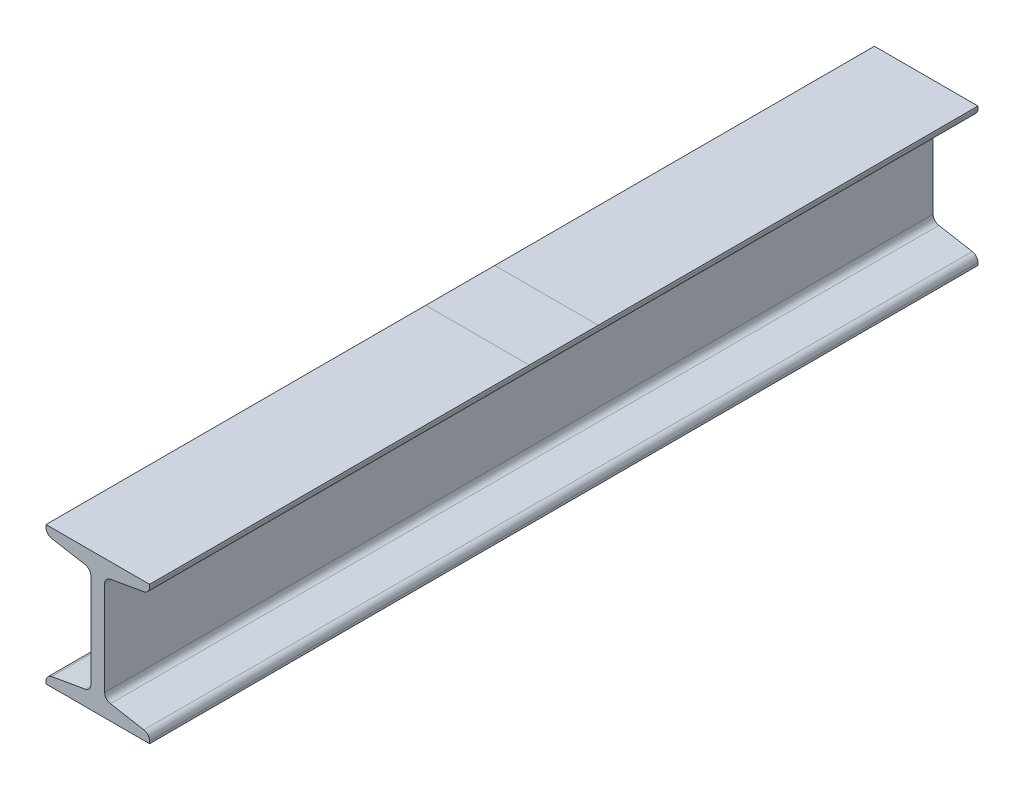
ISO-10303-21;
HEADER;
FILE_DESCRIPTION(('STEP AP214'),'2;1');
FILE_NAME('part.step','',(''),(''),'','','');
FILE_SCHEMA(('AUTOMOTIVE_DESIGN { 1 0 10303 214 1 1 1 1 }'));
ENDSEC;
DATA;
#1=APPLICATION_CONTEXT('core data for automotive mechanical design processes');
#2=APPLICATION_PROTOCOL_DEFINITION('international standard','automotive_design',2000,#1);
#3=PRODUCT_CONTEXT('',#1,'mechanical');
#4=PRODUCT('Part','Part','',(#3));
#5=PRODUCT_RELATED_PRODUCT_CATEGORY('part','',(#4));
#6=PRODUCT_DEFINITION_FORMATION('','',#4);
#7=PRODUCT_DEFINITION_CONTEXT('part definition',#1,'design');
#8=PRODUCT_DEFINITION('design','',#6,#7);
#9=PRODUCT_DEFINITION_SHAPE('','',#8);
#10=(LENGTH_UNIT() NAMED_UNIT(*) SI_UNIT(.MILLI.,.METRE.));
#11=(NAMED_UNIT(*) PLANE_ANGLE_UNIT() SI_UNIT($,.RADIAN.));
#12=(NAMED_UNIT(*) SI_UNIT($,.STERADIAN.) SOLID_ANGLE_UNIT());
#13=UNCERTAINTY_MEASURE_WITH_UNIT(LENGTH_MEASURE(1.E-05),#10,'distance_accuracy_value','');
#14=(GEOMETRIC_REPRESENTATION_CONTEXT(3) GLOBAL_UNCERTAINTY_ASSIGNED_CONTEXT((#13)) GLOBAL_UNIT_ASSIGNED_CONTEXT((#10,
#11,#12)) REPRESENTATION_CONTEXT('',''));
#15=CARTESIAN_POINT('',(0.,0.,0.));
#16=DIRECTION('',(0.,0.,1.));
#17=DIRECTION('',(1.,0.,0.));
#18=AXIS2_PLACEMENT_3D('',#15,#16,#17);
#19=CARTESIAN_POINT('',(-37.5,-50.,-600.));
#20=DIRECTION('',(0.,-1.,0.));
#21=DIRECTION('',(1.,0.,0.));
#22=AXIS2_PLACEMENT_3D('',#19,#20,#21);
#23=PLANE('',#22);
#24=DIRECTION('',(0.,0.,1.));
#25=VECTOR('',#24,1.);
#26=CARTESIAN_POINT('',(-37.5,-50.,-600.));
#27=LINE('',#26,#25);
#28=CARTESIAN_POINT('',(-37.5,-50.,-560.));
#29=VERTEX_POINT('',#28);
#30=CARTESIAN_POINT('',(-37.5,-50.,-40.));
#31=VERTEX_POINT('',#30);
#32=EDGE_CURVE('E471',#29,#31,#27,.T.);
#33=ORIENTED_EDGE('',*,*,#32,.F.);
#34=DIRECTION('',(1.,0.,0.));
#35=VECTOR('',#34,1.);
#36=CARTESIAN_POINT('',(-37.5,-50.,-560.));
#37=LINE('',#36,#35);
#38=CARTESIAN_POINT('',(37.5,-50.,-560.));
#39=VERTEX_POINT('',#38);
#40=EDGE_CURVE('E317',#29,#39,#37,.T.);
#41=ORIENTED_EDGE('',*,*,#40,.T.);
#42=DIRECTION('',(0.,0.,1.));
#43=VECTOR('',#42,1.);
#44=CARTESIAN_POINT('',(37.5,-50.,-600.));
#45=LINE('',#44,#43);
#46=CARTESIAN_POINT('',(37.5,-50.,-39.9999999999999));
#47=VERTEX_POINT('',#46);
#48=EDGE_CURVE('E474',#39,#47,#45,.T.);
#49=ORIENTED_EDGE('',*,*,#48,.T.);
#50=DIRECTION('',(-1.,0.,0.));
#51=VECTOR('',#50,1.);
#52=CARTESIAN_POINT('',(-37.5,-50.,-40.));
#53=LINE('',#52,#51);
#54=EDGE_CURVE('E323',#47,#31,#53,.T.);
#55=ORIENTED_EDGE('',*,*,#54,.T.);
#56=EDGE_LOOP('',(#33,#41,#49,#55));
#57=FACE_BOUND('',#56,.T.);
#58=ADVANCED_FACE('F52',(#57),#23,.T.);
#59=ORIENTED_EDGE('',*,*,#40,.F.);
#60=CARTESIAN_POINT('',(-37.5,-50.,-600.));
#61=VERTEX_POINT('',#60);
#62=EDGE_CURVE('E458',#61,#29,#27,.T.);
#63=ORIENTED_EDGE('',*,*,#62,.F.);
#64=DIRECTION('',(1.,0.,0.));
#65=VECTOR('',#64,1.);
#66=CARTESIAN_POINT('',(-37.5,-50.,-600.));
#67=LINE('',#66,#65);
#68=CARTESIAN_POINT('',(37.5,-50.,-600.));
#69=VERTEX_POINT('',#68);
#70=EDGE_CURVE('E260',#61,#69,#67,.T.);
#71=ORIENTED_EDGE('',*,*,#70,.T.);
#72=EDGE_CURVE('E488',#69,#39,#45,.T.);
#73=ORIENTED_EDGE('',*,*,#72,.T.);
#74=EDGE_LOOP('',(#59,#63,#71,#73));
#75=FACE_BOUND('',#74,.T.);
#76=ADVANCED_FACE('F557',(#75),#23,.T.);
#77=CARTESIAN_POINT('',(-37.5,50.,-600.));
#78=DIRECTION('',(0.,1.,0.));
#79=DIRECTION('',(-1.,0.,0.));
#80=AXIS2_PLACEMENT_3D('',#77,#78,#79);
#81=PLANE('',#80);
#82=DIRECTION('',(0.,0.,1.));
#83=VECTOR('',#82,1.);
#84=CARTESIAN_POINT('',(-37.5,50.,-600.));
#85=LINE('',#84,#83);
#86=CARTESIAN_POINT('',(-37.5,50.,-600.));
#87=VERTEX_POINT('',#86);
#88=CARTESIAN_POINT('',(-37.5,50.,-325.));
#89=VERTEX_POINT('',#88);
#90=EDGE_CURVE('E215',#87,#89,#85,.T.);
#91=ORIENTED_EDGE('',*,*,#90,.T.);
#92=DIRECTION('',(1.,0.,0.));
#93=VECTOR('',#92,1.);
#94=CARTESIAN_POINT('',(-37.5,50.,-325.));
#95=LINE('',#94,#93);
#96=CARTESIAN_POINT('',(37.5,50.,-325.));
#97=VERTEX_POINT('',#96);
#98=EDGE_CURVE('E460',#89,#97,#95,.T.);
#99=ORIENTED_EDGE('',*,*,#98,.T.);
#100=DIRECTION('',(0.,0.,1.));
#101=VECTOR('',#100,1.);
#102=CARTESIAN_POINT('',(37.5,50.,-600.));
#103=LINE('',#102,#101);
#104=CARTESIAN_POINT('',(37.5,50.,-600.));
#105=VERTEX_POINT('',#104);
#106=EDGE_CURVE('E239',#105,#97,#103,.T.);
#107=ORIENTED_EDGE('',*,*,#106,.F.);
#108=DIRECTION('',(-1.,0.,0.));
#109=VECTOR('',#108,1.);
#110=CARTESIAN_POINT('',(-37.5,50.,-600.));
#111=LINE('',#110,#109);
#112=EDGE_CURVE('E232',#105,#87,#111,.T.);
#113=ORIENTED_EDGE('',*,*,#112,.T.);
#114=EDGE_LOOP('',(#91,#99,#107,#113));
#115=FACE_BOUND('',#114,.T.);
#116=ADVANCED_FACE('F237',(#115),#81,.T.);
#117=CARTESIAN_POINT('',(37.5,50.,-275.));
#118=VERTEX_POINT('',#117);
#119=CARTESIAN_POINT('',(37.5,50.,0.));
#120=VERTEX_POINT('',#119);
#121=EDGE_CURVE('E451',#118,#120,#103,.T.);
#122=ORIENTED_EDGE('',*,*,#121,.F.);
#123=DIRECTION('',(-1.,0.,0.));
#124=VECTOR('',#123,1.);
#125=CARTESIAN_POINT('',(-37.5,50.,-275.));
#126=LINE('',#125,#124);
#127=CARTESIAN_POINT('',(-37.5,50.,-275.));
#128=VERTEX_POINT('',#127);
#129=EDGE_CURVE('E453',#118,#128,#126,.T.);
#130=ORIENTED_EDGE('',*,*,#129,.T.);
#131=CARTESIAN_POINT('',(-37.5,50.,0.));
#132=VERTEX_POINT('',#131);
#133=EDGE_CURVE('E228',#128,#132,#85,.T.);
#134=ORIENTED_EDGE('',*,*,#133,.T.);
#135=DIRECTION('',(-1.,0.,0.));
#136=VECTOR('',#135,1.);
#137=CARTESIAN_POINT('',(-37.5,50.,0.));
#138=LINE('',#137,#136);
#139=EDGE_CURVE('E283',#120,#132,#138,.T.);
#140=ORIENTED_EDGE('',*,*,#139,.F.);
#141=EDGE_LOOP('',(#122,#130,#134,#140));
#142=FACE_BOUND('',#141,.T.);
#143=ADVANCED_FACE('F450',(#142),#81,.T.);
#144=ORIENTED_EDGE('',*,*,#98,.F.);
#145=EDGE_CURVE('E222',#89,#128,#85,.T.);
#146=ORIENTED_EDGE('',*,*,#145,.T.);
#147=ORIENTED_EDGE('',*,*,#129,.F.);
#148=EDGE_CURVE('E497',#97,#118,#103,.T.);
#149=ORIENTED_EDGE('',*,*,#148,.F.);
#150=EDGE_LOOP('',(#144,#146,#147,#149));
#151=FACE_BOUND('',#150,.T.);
#152=ADVANCED_FACE('F581',(#151),#81,.T.);
#153=CARTESIAN_POINT('',(37.5,50.,-600.));
#154=DIRECTION('',(1.,0.,0.));
#155=DIRECTION('',(0.,1.,0.));
#156=AXIS2_PLACEMENT_3D('',#153,#154,#155);
#157=PLANE('',#156);
#158=DIRECTION('',(0.,1.,0.));
#159=VECTOR('',#158,1.);
#160=CARTESIAN_POINT('',(37.5,50.,0.));
#161=LINE('',#160,#159);
#162=CARTESIAN_POINT('',(37.5,48.2322176558608,0.));
#163=VERTEX_POINT('',#162);
#164=EDGE_CURVE('E241',#163,#120,#161,.T.);
#165=ORIENTED_EDGE('',*,*,#164,.F.);
#166=DIRECTION('',(0.,0.,1.));
#167=VECTOR('',#166,1.);
#168=CARTESIAN_POINT('',(37.5,48.2322176558608,-600.));
#169=LINE('',#168,#167);
#170=CARTESIAN_POINT('',(37.5,48.2322176558608,-600.));
#171=VERTEX_POINT('',#170);
#172=EDGE_CURVE('E343',#163,#171,#169,.F.);
#173=ORIENTED_EDGE('',*,*,#172,.T.);
#174=DIRECTION('',(0.,1.,0.));
#175=VECTOR('',#174,1.);
#176=CARTESIAN_POINT('',(37.5,50.,-600.));
#177=LINE('',#176,#175);
#178=EDGE_CURVE('E280',#171,#105,#177,.T.);
#179=ORIENTED_EDGE('',*,*,#178,.T.);
#180=ORIENTED_EDGE('',*,*,#106,.T.);
#181=ORIENTED_EDGE('',*,*,#148,.T.);
#182=ORIENTED_EDGE('',*,*,#121,.T.);
#183=EDGE_LOOP('',(#165,#173,#179,#180,#181,#182));
#184=FACE_BOUND('',#183,.T.);
#185=ADVANCED_FACE('F501',(#184),#157,.T.);
#186=CARTESIAN_POINT('',(37.5,44.0367194999744,-600.));
#187=DIRECTION('',(0.173648177666926,-0.984807753012209,0.));
#188=DIRECTION('',(0.984807753012209,0.173648177666926,0.));
#189=AXIS2_PLACEMENT_3D('',#186,#187,#188);
#190=PLANE('',#189);
#191=DIRECTION('',(0.984807753012209,0.173648177666926,0.));
#192=VECTOR('',#191,1.);
#193=CARTESIAN_POINT('',(37.5,44.0367194999744,-600.));
#194=LINE('',#193,#192);
#195=CARTESIAN_POINT('',(9.13175911166539,39.0346332361241,-600.));
#196=VERTEX_POINT('',#195);
#197=CARTESIAN_POINT('',(33.3682408883346,43.3081788907998,-600.));
#198=VERTEX_POINT('',#197);
#199=EDGE_CURVE('E276',#196,#198,#194,.T.);
#200=ORIENTED_EDGE('',*,*,#199,.T.);
#201=DIRECTION('',(0.,0.,1.));
#202=VECTOR('',#201,1.);
#203=CARTESIAN_POINT('',(33.3682408883346,43.3081788907998,-600.));
#204=LINE('',#203,#202);
#205=CARTESIAN_POINT('',(33.3682408883346,43.3081788907998,0.));
#206=VERTEX_POINT('',#205);
#207=EDGE_CURVE('E327',#198,#206,#204,.T.);
#208=ORIENTED_EDGE('',*,*,#207,.T.);
#209=DIRECTION('',(0.984807753012209,0.173648177666926,0.));
#210=VECTOR('',#209,1.);
#211=CARTESIAN_POINT('',(37.5,44.0367194999744,0.));
#212=LINE('',#211,#210);
#213=CARTESIAN_POINT('',(9.13175911166539,39.0346332361241,0.));
#214=VERTEX_POINT('',#213);
#215=EDGE_CURVE('E244',#214,#206,#212,.T.);
#216=ORIENTED_EDGE('',*,*,#215,.F.);
#217=DIRECTION('',(0.,0.,1.));
#218=VECTOR('',#217,1.);
#219=CARTESIAN_POINT('',(9.13175911166539,39.0346332361241,-600.));
#220=LINE('',#219,#218);
#221=EDGE_CURVE('E322',#214,#196,#220,.F.);
#222=ORIENTED_EDGE('',*,*,#221,.T.);
#223=EDGE_LOOP('',(#200,#208,#216,#222));
#224=FACE_BOUND('',#223,.T.);
#225=ADVANCED_FACE('F510',(#224),#190,.T.);
#226=CARTESIAN_POINT('',(5.00000000000002,38.3060926269495,-600.));
#227=DIRECTION('',(1.,0.,0.));
#228=DIRECTION('',(0.,1.,0.));
#229=AXIS2_PLACEMENT_3D('',#226,#227,#228);
#230=PLANE('',#229);
#231=DIRECTION('',(0.,1.,0.));
#232=VECTOR('',#231,1.);
#233=CARTESIAN_POINT('',(5.00000000000002,38.3060926269495,-600.));
#234=LINE('',#233,#232);
#235=CARTESIAN_POINT('',(5.00000000000003,-34.1105944710631,-600.));
#236=VERTEX_POINT('',#235);
#237=CARTESIAN_POINT('',(5.00000000000002,34.1105944710631,-600.));
#238=VERTEX_POINT('',#237);
#239=EDGE_CURVE('E272',#236,#238,#234,.T.);
#240=ORIENTED_EDGE('',*,*,#239,.T.);
#241=DIRECTION('',(0.,0.,1.));
#242=VECTOR('',#241,1.);
#243=CARTESIAN_POINT('',(5.00000000000002,34.1105944710631,-2.22044604925031E-13));
#244=LINE('',#243,#242);
#245=CARTESIAN_POINT('',(5.00000000000002,34.1105944710631,0.));
#246=VERTEX_POINT('',#245);
#247=EDGE_CURVE('E360',#238,#246,#244,.T.);
#248=ORIENTED_EDGE('',*,*,#247,.T.);
#249=DIRECTION('',(0.,1.,0.));
#250=VECTOR('',#249,1.);
#251=CARTESIAN_POINT('',(5.00000000000002,38.3060926269495,0.));
#252=LINE('',#251,#250);
#253=CARTESIAN_POINT('',(5.00000000000003,-34.1105944710631,0.));
#254=VERTEX_POINT('',#253);
#255=EDGE_CURVE('E514',#254,#246,#252,.T.);
#256=ORIENTED_EDGE('',*,*,#255,.F.);
#257=DIRECTION('',(0.,0.,1.));
#258=VECTOR('',#257,1.);
#259=CARTESIAN_POINT('',(5.00000000000003,-34.1105944710631,-600.));
#260=LINE('',#259,#258);
#261=EDGE_CURVE('E357',#254,#236,#260,.F.);
#262=ORIENTED_EDGE('',*,*,#261,.T.);
#263=EDGE_LOOP('',(#240,#248,#256,#262));
#264=FACE_BOUND('',#263,.T.);
#265=ADVANCED_FACE('F543',(#264),#230,.T.);
#266=CARTESIAN_POINT('',(5.00000000000003,-38.3060926269495,-600.));
#267=DIRECTION('',(0.173648177666925,0.984807753012209,0.));
#268=DIRECTION('',(-0.984807753012209,0.173648177666925,0.));
#269=AXIS2_PLACEMENT_3D('',#266,#267,#268);
#270=PLANE('',#269);
#271=DIRECTION('',(-0.984807753012209,0.173648177666925,0.));
#272=VECTOR('',#271,1.);
#273=CARTESIAN_POINT('',(5.00000000000003,-38.3060926269495,0.));
#274=LINE('',#273,#272);
#275=CARTESIAN_POINT('',(33.3682408883346,-43.3081788907998,0.));
#276=VERTEX_POINT('',#275);
#277=CARTESIAN_POINT('',(9.1317591116654,-39.0346332361241,0.));
#278=VERTEX_POINT('',#277);
#279=EDGE_CURVE('E517',#276,#278,#274,.T.);
#280=ORIENTED_EDGE('',*,*,#279,.F.);
#281=DIRECTION('',(0.,0.,1.));
#282=VECTOR('',#281,1.);
#283=CARTESIAN_POINT('',(33.3682408883346,-43.3081788907998,-600.));
#284=LINE('',#283,#282);
#285=CARTESIAN_POINT('',(33.3682408883346,-43.3081788907998,-600.));
#286=VERTEX_POINT('',#285);
#287=EDGE_CURVE('E372',#276,#286,#284,.F.);
#288=ORIENTED_EDGE('',*,*,#287,.T.);
#289=DIRECTION('',(-0.984807753012209,0.173648177666925,0.));
#290=VECTOR('',#289,1.);
#291=CARTESIAN_POINT('',(5.00000000000003,-38.3060926269495,-600.));
#292=LINE('',#291,#290);
#293=CARTESIAN_POINT('',(9.1317591116654,-39.0346332361241,-600.));
#294=VERTEX_POINT('',#293);
#295=EDGE_CURVE('E268',#286,#294,#292,.T.);
#296=ORIENTED_EDGE('',*,*,#295,.T.);
#297=DIRECTION('',(0.,0.,1.));
#298=VECTOR('',#297,1.);
#299=CARTESIAN_POINT('',(9.1317591116654,-39.0346332361241,-2.22044604925031E-13));
#300=LINE('',#299,#298);
#301=EDGE_CURVE('E368',#294,#278,#300,.T.);
#302=ORIENTED_EDGE('',*,*,#301,.T.);
#303=EDGE_LOOP('',(#280,#288,#296,#302));
#304=FACE_BOUND('',#303,.T.);
#305=ADVANCED_FACE('F534',(#304),#270,.T.);
#306=CARTESIAN_POINT('',(37.5,-44.0367194999744,-600.));
#307=DIRECTION('',(1.,0.,0.));
#308=DIRECTION('',(0.,1.,0.));
#309=AXIS2_PLACEMENT_3D('',#306,#307,#308);
#310=PLANE('',#309);
#311=DIRECTION('',(0.,1.,0.));
#312=VECTOR('',#311,1.);
#313=CARTESIAN_POINT('',(37.5,-44.0367194999744,-600.));
#314=LINE('',#313,#312);
#315=CARTESIAN_POINT('',(37.5,-48.2322176558608,-600.));
#316=VERTEX_POINT('',#315);
#317=EDGE_CURVE('E264',#69,#316,#314,.T.);
#318=ORIENTED_EDGE('',*,*,#317,.T.);
#319=DIRECTION('',(0.,0.,1.));
#320=VECTOR('',#319,1.);
#321=CARTESIAN_POINT('',(37.5,-48.2322176558608,-600.));
#322=LINE('',#321,#320);
#323=CARTESIAN_POINT('',(37.5,-48.2322176558608,0.));
#324=VERTEX_POINT('',#323);
#325=EDGE_CURVE('E364',#316,#324,#322,.T.);
#326=ORIENTED_EDGE('',*,*,#325,.T.);
#327=DIRECTION('',(0.,1.,0.));
#328=VECTOR('',#327,1.);
#329=CARTESIAN_POINT('',(37.5,-44.0367194999744,0.));
#330=LINE('',#329,#328);
#331=CARTESIAN_POINT('',(37.5,-50.,0.));
#332=VERTEX_POINT('',#331);
#333=EDGE_CURVE('E311',#332,#324,#330,.T.);
#334=ORIENTED_EDGE('',*,*,#333,.F.);
#335=EDGE_CURVE('E485',#47,#332,#45,.T.);
#336=ORIENTED_EDGE('',*,*,#335,.F.);
#337=ORIENTED_EDGE('',*,*,#48,.F.);
#338=ORIENTED_EDGE('',*,*,#72,.F.);
#339=EDGE_LOOP('',(#318,#326,#334,#336,#337,#338));
#340=FACE_BOUND('',#339,.T.);
#341=ADVANCED_FACE('F525',(#340),#310,.T.);
#342=ORIENTED_EDGE('',*,*,#54,.F.);
#343=ORIENTED_EDGE('',*,*,#335,.T.);
#344=DIRECTION('',(1.,0.,0.));
#345=VECTOR('',#344,1.);
#346=CARTESIAN_POINT('',(-37.5,-50.,0.));
#347=LINE('',#346,#345);
#348=CARTESIAN_POINT('',(-37.5,-50.,0.));
#349=VERTEX_POINT('',#348);
#350=EDGE_CURVE('E306',#349,#332,#347,.T.);
#351=ORIENTED_EDGE('',*,*,#350,.F.);
#352=EDGE_CURVE('E226',#31,#349,#27,.T.);
#353=ORIENTED_EDGE('',*,*,#352,.F.);
#354=EDGE_LOOP('',(#342,#343,#351,#353));
#355=FACE_BOUND('',#354,.T.);
#356=ADVANCED_FACE('F479',(#355),#23,.T.);
#357=CARTESIAN_POINT('',(-37.5,-44.0367194999744,-600.));
#358=DIRECTION('',(-1.,0.,0.));
#359=DIRECTION('',(0.,0.,1.));
#360=AXIS2_PLACEMENT_3D('',#357,#358,#359);
#361=PLANE('',#360);
#362=DIRECTION('',(0.,-1.,0.));
#363=VECTOR('',#362,1.);
#364=CARTESIAN_POINT('',(-37.5,-44.0367194999744,0.));
#365=LINE('',#364,#363);
#366=CARTESIAN_POINT('',(-37.5,-48.2322176558608,0.));
#367=VERTEX_POINT('',#366);
#368=EDGE_CURVE('E303',#367,#349,#365,.T.);
#369=ORIENTED_EDGE('',*,*,#368,.F.);
#370=DIRECTION('',(0.,0.,1.));
#371=VECTOR('',#370,1.);
#372=CARTESIAN_POINT('',(-37.5,-48.2322176558608,-600.));
#373=LINE('',#372,#371);
#374=CARTESIAN_POINT('',(-37.5,-48.2322176558608,-600.));
#375=VERTEX_POINT('',#374);
#376=EDGE_CURVE('E399',#367,#375,#373,.F.);
#377=ORIENTED_EDGE('',*,*,#376,.T.);
#378=DIRECTION('',(0.,-1.,0.));
#379=VECTOR('',#378,1.);
#380=CARTESIAN_POINT('',(-37.5,-44.0367194999744,-600.));
#381=LINE('',#380,#379);
#382=EDGE_CURVE('E257',#375,#61,#381,.T.);
#383=ORIENTED_EDGE('',*,*,#382,.T.);
#384=ORIENTED_EDGE('',*,*,#62,.T.);
#385=ORIENTED_EDGE('',*,*,#32,.T.);
#386=ORIENTED_EDGE('',*,*,#352,.T.);
#387=EDGE_LOOP('',(#369,#377,#383,#384,#385,#386));
#388=FACE_BOUND('',#387,.T.);
#389=ADVANCED_FACE('F565',(#388),#361,.T.);
#390=CARTESIAN_POINT('',(-5.00000000000001,-38.3060926269495,-600.));
#391=DIRECTION('',(-0.173648177666926,0.984807753012209,0.));
#392=DIRECTION('',(-0.984807753012209,-0.173648177666926,0.));
#393=AXIS2_PLACEMENT_3D('',#390,#391,#392);
#394=PLANE('',#393);
#395=DIRECTION('',(-0.984807753012209,-0.173648177666926,0.));
#396=VECTOR('',#395,1.);
#397=CARTESIAN_POINT('',(-5.00000000000001,-38.3060926269495,-600.));
#398=LINE('',#397,#396);
#399=CARTESIAN_POINT('',(-9.13175911166538,-39.0346332361241,-600.));
#400=VERTEX_POINT('',#399);
#401=CARTESIAN_POINT('',(-33.3682408883346,-43.3081788907998,-600.));
#402=VERTEX_POINT('',#401);
#403=EDGE_CURVE('E253',#400,#402,#398,.T.);
#404=ORIENTED_EDGE('',*,*,#403,.T.);
#405=DIRECTION('',(0.,0.,1.));
#406=VECTOR('',#405,1.);
#407=CARTESIAN_POINT('',(-33.3682408883346,-43.3081788907998,-600.));
#408=LINE('',#407,#406);
#409=CARTESIAN_POINT('',(-33.3682408883346,-43.3081788907998,0.));
#410=VERTEX_POINT('',#409);
#411=EDGE_CURVE('E394',#402,#410,#408,.T.);
#412=ORIENTED_EDGE('',*,*,#411,.T.);
#413=DIRECTION('',(-0.984807753012209,-0.173648177666926,0.));
#414=VECTOR('',#413,1.);
#415=CARTESIAN_POINT('',(-5.00000000000001,-38.3060926269495,0.));
#416=LINE('',#415,#414);
#417=CARTESIAN_POINT('',(-9.13175911166538,-39.0346332361241,0.));
#418=VERTEX_POINT('',#417);
#419=EDGE_CURVE('E299',#418,#410,#416,.T.);
#420=ORIENTED_EDGE('',*,*,#419,.F.);
#421=DIRECTION('',(0.,0.,1.));
#422=VECTOR('',#421,1.);
#423=CARTESIAN_POINT('',(-9.13175911166538,-39.0346332361241,-600.));
#424=LINE('',#423,#422);
#425=EDGE_CURVE('E392',#418,#400,#424,.F.);
#426=ORIENTED_EDGE('',*,*,#425,.T.);
#427=EDGE_LOOP('',(#404,#412,#420,#426));
#428=FACE_BOUND('',#427,.T.);
#429=ADVANCED_FACE('F428',(#428),#394,.T.);
#430=CARTESIAN_POINT('',(-5.00000000000002,38.3060926269495,-600.));
#431=DIRECTION('',(-1.,0.,0.));
#432=DIRECTION('',(0.,-1.,0.));
#433=AXIS2_PLACEMENT_3D('',#430,#431,#432);
#434=PLANE('',#433);
#435=DIRECTION('',(0.,-1.,0.));
#436=VECTOR('',#435,1.);
#437=CARTESIAN_POINT('',(-5.00000000000002,38.3060926269495,0.));
#438=LINE('',#437,#436);
#439=CARTESIAN_POINT('',(-5.00000000000002,34.1105944710631,0.));
#440=VERTEX_POINT('',#439);
#441=CARTESIAN_POINT('',(-5.00000000000001,-34.1105944710631,0.));
#442=VERTEX_POINT('',#441);
#443=EDGE_CURVE('E295',#440,#442,#438,.T.);
#444=ORIENTED_EDGE('',*,*,#443,.F.);
#445=DIRECTION('',(0.,0.,1.));
#446=VECTOR('',#445,1.);
#447=CARTESIAN_POINT('',(-5.00000000000002,34.1105944710631,-600.));
#448=LINE('',#447,#446);
#449=CARTESIAN_POINT('',(-5.00000000000002,34.1105944710631,-600.));
#450=VERTEX_POINT('',#449);
#451=EDGE_CURVE('E389',#440,#450,#448,.F.);
#452=ORIENTED_EDGE('',*,*,#451,.T.);
#453=DIRECTION('',(0.,-1.,0.));
#454=VECTOR('',#453,1.);
#455=CARTESIAN_POINT('',(-5.00000000000002,38.3060926269495,-600.));
#456=LINE('',#455,#454);
#457=CARTESIAN_POINT('',(-5.00000000000001,-34.1105944710631,-600.));
#458=VERTEX_POINT('',#457);
#459=EDGE_CURVE('E249',#450,#458,#456,.T.);
#460=ORIENTED_EDGE('',*,*,#459,.T.);
#461=DIRECTION('',(0.,0.,1.));
#462=VECTOR('',#461,1.);
#463=CARTESIAN_POINT('',(-5.00000000000001,-34.1105944710631,0.));
#464=LINE('',#463,#462);
#465=EDGE_CURVE('E385',#458,#442,#464,.T.);
#466=ORIENTED_EDGE('',*,*,#465,.T.);
#467=EDGE_LOOP('',(#444,#452,#460,#466));
#468=FACE_BOUND('',#467,.T.);
#469=ADVANCED_FACE('F433',(#468),#434,.T.);
#470=CARTESIAN_POINT('',(-37.5,44.0367194999744,-600.));
#471=DIRECTION('',(-0.173648177666926,-0.984807753012209,0.));
#472=DIRECTION('',(0.984807753012209,-0.173648177666926,0.));
#473=AXIS2_PLACEMENT_3D('',#470,#471,#472);
#474=PLANE('',#473);
#475=DIRECTION('',(0.984807753012209,-0.173648177666926,0.));
#476=VECTOR('',#475,1.);
#477=CARTESIAN_POINT('',(-37.5,44.0367194999744,0.));
#478=LINE('',#477,#476);
#479=CARTESIAN_POINT('',(-33.3682408883346,43.3081788907998,0.));
#480=VERTEX_POINT('',#479);
#481=CARTESIAN_POINT('',(-9.13175911166539,39.0346332361241,0.));
#482=VERTEX_POINT('',#481);
#483=EDGE_CURVE('E291',#480,#482,#478,.T.);
#484=ORIENTED_EDGE('',*,*,#483,.F.);
#485=DIRECTION('',(0.,0.,1.));
#486=VECTOR('',#485,1.);
#487=CARTESIAN_POINT('',(-33.3682408883346,43.3081788907998,-600.));
#488=LINE('',#487,#486);
#489=CARTESIAN_POINT('',(-33.3682408883346,43.3081788907998,-600.));
#490=VERTEX_POINT('',#489);
#491=EDGE_CURVE('E382',#480,#490,#488,.F.);
#492=ORIENTED_EDGE('',*,*,#491,.T.);
#493=DIRECTION('',(0.984807753012209,-0.173648177666926,0.));
#494=VECTOR('',#493,1.);
#495=CARTESIAN_POINT('',(-37.5,44.0367194999744,-600.));
#496=LINE('',#495,#494);
#497=CARTESIAN_POINT('',(-9.13175911166539,39.0346332361241,-600.));
#498=VERTEX_POINT('',#497);
#499=EDGE_CURVE('E234',#490,#498,#496,.T.);
#500=ORIENTED_EDGE('',*,*,#499,.T.);
#501=DIRECTION('',(0.,0.,1.));
#502=VECTOR('',#501,1.);
#503=CARTESIAN_POINT('',(-9.13175911166539,39.0346332361241,-2.22044604925031E-13));
#504=LINE('',#503,#502);
#505=EDGE_CURVE('E378',#498,#482,#504,.T.);
#506=ORIENTED_EDGE('',*,*,#505,.T.);
#507=EDGE_LOOP('',(#484,#492,#500,#506));
#508=FACE_BOUND('',#507,.T.);
#509=ADVANCED_FACE('F440',(#508),#474,.T.);
#510=CARTESIAN_POINT('',(-37.5,50.,-600.));
#511=DIRECTION('',(-1.,0.,0.));
#512=DIRECTION('',(0.,0.,1.));
#513=AXIS2_PLACEMENT_3D('',#510,#511,#512);
#514=PLANE('',#513);
#515=DIRECTION('',(0.,-1.,0.));
#516=VECTOR('',#515,1.);
#517=CARTESIAN_POINT('',(-37.5,50.,-600.));
#518=LINE('',#517,#516);
#519=CARTESIAN_POINT('',(-37.5,48.2322176558608,-600.));
#520=VERTEX_POINT('',#519);
#521=EDGE_CURVE('E218',#87,#520,#518,.T.);
#522=ORIENTED_EDGE('',*,*,#521,.T.);
#523=DIRECTION('',(0.,0.,1.));
#524=VECTOR('',#523,1.);
#525=CARTESIAN_POINT('',(-37.5,48.2322176558608,-600.));
#526=LINE('',#525,#524);
#527=CARTESIAN_POINT('',(-37.5,48.2322176558608,0.));
#528=VERTEX_POINT('',#527);
#529=EDGE_CURVE('E375',#520,#528,#526,.T.);
#530=ORIENTED_EDGE('',*,*,#529,.T.);
#531=DIRECTION('',(0.,-1.,0.));
#532=VECTOR('',#531,1.);
#533=CARTESIAN_POINT('',(-37.5,50.,0.));
#534=LINE('',#533,#532);
#535=EDGE_CURVE('E287',#132,#528,#534,.T.);
#536=ORIENTED_EDGE('',*,*,#535,.F.);
#537=ORIENTED_EDGE('',*,*,#133,.F.);
#538=ORIENTED_EDGE('',*,*,#145,.F.);
#539=ORIENTED_EDGE('',*,*,#90,.F.);
#540=EDGE_LOOP('',(#522,#530,#536,#537,#538,#539));
#541=FACE_BOUND('',#540,.T.);
#542=ADVANCED_FACE('F216',(#541),#514,.T.);
#543=CARTESIAN_POINT('',(0.,0.,-600.));
#544=DIRECTION('',(0.,0.,-1.));
#545=DIRECTION('',(-1.,0.,0.));
#546=AXIS2_PLACEMENT_3D('',#543,#544,#545);
#547=PLANE('',#546);
#548=ORIENTED_EDGE('',*,*,#178,.F.);
#549=CARTESIAN_POINT('',(32.5,48.2322176558608,-600.));
#550=DIRECTION('',(0.,0.,-1.));
#551=DIRECTION('',(-1.,0.,0.));
#552=AXIS2_PLACEMENT_3D('',#549,#550,#551);
#553=CIRCLE('',#552,5.);
#554=EDGE_CURVE('E354',#171,#198,#553,.T.);
#555=ORIENTED_EDGE('',*,*,#554,.T.);
#556=ORIENTED_EDGE('',*,*,#199,.F.);
#557=CARTESIAN_POINT('',(10.,34.1105944710631,-600.));
#558=DIRECTION('',(0.,0.,-1.));
#559=DIRECTION('',(-1.,0.,0.));
#560=AXIS2_PLACEMENT_3D('',#557,#558,#559);
#561=CIRCLE('',#560,5.);
#562=EDGE_CURVE('E405',#196,#238,#561,.F.);
#563=ORIENTED_EDGE('',*,*,#562,.T.);
#564=ORIENTED_EDGE('',*,*,#239,.F.);
#565=CARTESIAN_POINT('',(10.,-34.1105944710631,-600.));
#566=DIRECTION('',(0.,0.,-1.));
#567=DIRECTION('',(-1.,0.,0.));
#568=AXIS2_PLACEMENT_3D('',#565,#566,#567);
#569=CIRCLE('',#568,5.);
#570=EDGE_CURVE('E411',#236,#294,#569,.F.);
#571=ORIENTED_EDGE('',*,*,#570,.T.);
#572=ORIENTED_EDGE('',*,*,#295,.F.);
#573=CARTESIAN_POINT('',(32.5,-48.2322176558608,-600.));
#574=DIRECTION('',(0.,0.,-1.));
#575=DIRECTION('',(-1.,0.,0.));
#576=AXIS2_PLACEMENT_3D('',#573,#574,#575);
#577=CIRCLE('',#576,5.);
#578=EDGE_CURVE('E351',#286,#316,#577,.T.);
#579=ORIENTED_EDGE('',*,*,#578,.T.);
#580=ORIENTED_EDGE('',*,*,#317,.F.);
#581=ORIENTED_EDGE('',*,*,#70,.F.);
#582=ORIENTED_EDGE('',*,*,#382,.F.);
#583=CARTESIAN_POINT('',(-32.5,-48.2322176558608,-600.));
#584=DIRECTION('',(0.,0.,-1.));
#585=DIRECTION('',(-1.,0.,0.));
#586=AXIS2_PLACEMENT_3D('',#583,#584,#585);
#587=CIRCLE('',#586,5.);
#588=EDGE_CURVE('E346',#375,#402,#587,.T.);
#589=ORIENTED_EDGE('',*,*,#588,.T.);
#590=ORIENTED_EDGE('',*,*,#403,.F.);
#591=CARTESIAN_POINT('',(-10.,-34.1105944710631,-600.));
#592=DIRECTION('',(0.,0.,-1.));
#593=DIRECTION('',(-1.,0.,0.));
#594=AXIS2_PLACEMENT_3D('',#591,#592,#593);
#595=CIRCLE('',#594,5.);
#596=EDGE_CURVE('E12',#400,#458,#595,.F.);
#597=ORIENTED_EDGE('',*,*,#596,.T.);
#598=ORIENTED_EDGE('',*,*,#459,.F.);
#599=CARTESIAN_POINT('',(-10.,34.1105944710631,-600.));
#600=DIRECTION('',(0.,0.,-1.));
#601=DIRECTION('',(-1.,0.,0.));
#602=AXIS2_PLACEMENT_3D('',#599,#600,#601);
#603=CIRCLE('',#602,5.);
#604=EDGE_CURVE('E74',#450,#498,#603,.F.);
#605=ORIENTED_EDGE('',*,*,#604,.T.);
#606=ORIENTED_EDGE('',*,*,#499,.F.);
#607=CARTESIAN_POINT('',(-32.5,48.2322176558608,-600.));
#608=DIRECTION('',(0.,0.,-1.));
#609=DIRECTION('',(-1.,0.,0.));
#610=AXIS2_PLACEMENT_3D('',#607,#608,#609);
#611=CIRCLE('',#610,5.);
#612=EDGE_CURVE('E68',#490,#520,#611,.T.);
#613=ORIENTED_EDGE('',*,*,#612,.T.);
#614=ORIENTED_EDGE('',*,*,#521,.F.);
#615=ORIENTED_EDGE('',*,*,#112,.F.);
#616=EDGE_LOOP('',(#548,#555,#556,#563,#564,#571,#572,#579,#580,#581,#582,#589,#590,#597,#598,
#605,#606,#613,#614,#615));
#617=FACE_BOUND('',#616,.T.);
#618=ADVANCED_FACE('F231',(#617),#547,.T.);
#619=CARTESIAN_POINT('',(0.,0.,0.));
#620=DIRECTION('',(0.,0.,-1.));
#621=DIRECTION('',(-1.,0.,0.));
#622=AXIS2_PLACEMENT_3D('',#619,#620,#621);
#623=PLANE('',#622);
#624=ORIENTED_EDGE('',*,*,#215,.T.);
#625=CARTESIAN_POINT('',(32.5,48.2322176558608,0.));
#626=DIRECTION('',(0.,0.,-1.));
#627=DIRECTION('',(-1.,0.,0.));
#628=AXIS2_PLACEMENT_3D('',#625,#626,#627);
#629=CIRCLE('',#628,5.);
#630=EDGE_CURVE('E340',#206,#163,#629,.F.);
#631=ORIENTED_EDGE('',*,*,#630,.T.);
#632=ORIENTED_EDGE('',*,*,#164,.T.);
#633=ORIENTED_EDGE('',*,*,#139,.T.);
#634=ORIENTED_EDGE('',*,*,#535,.T.);
#635=CARTESIAN_POINT('',(-32.5,48.2322176558608,0.));
#636=DIRECTION('',(0.,0.,-1.));
#637=DIRECTION('',(-1.,0.,0.));
#638=AXIS2_PLACEMENT_3D('',#635,#636,#637);
#639=CIRCLE('',#638,5.);
#640=EDGE_CURVE('E334',#528,#480,#639,.F.);
#641=ORIENTED_EDGE('',*,*,#640,.T.);
#642=ORIENTED_EDGE('',*,*,#483,.T.);
#643=CARTESIAN_POINT('',(-10.,34.1105944710631,0.));
#644=DIRECTION('',(0.,0.,-1.));
#645=DIRECTION('',(-1.,0.,0.));
#646=AXIS2_PLACEMENT_3D('',#643,#644,#645);
#647=CIRCLE('',#646,5.);
#648=EDGE_CURVE('E414',#482,#440,#647,.T.);
#649=ORIENTED_EDGE('',*,*,#648,.T.);
#650=ORIENTED_EDGE('',*,*,#443,.T.);
#651=CARTESIAN_POINT('',(-10.,-34.1105944710631,0.));
#652=DIRECTION('',(0.,0.,-1.));
#653=DIRECTION('',(-1.,0.,0.));
#654=AXIS2_PLACEMENT_3D('',#651,#652,#653);
#655=CIRCLE('',#654,5.);
#656=EDGE_CURVE('E61',#442,#418,#655,.T.);
#657=ORIENTED_EDGE('',*,*,#656,.T.);
#658=ORIENTED_EDGE('',*,*,#419,.T.);
#659=CARTESIAN_POINT('',(-32.5,-48.2322176558608,0.));
#660=DIRECTION('',(0.,0.,-1.));
#661=DIRECTION('',(-1.,0.,0.));
#662=AXIS2_PLACEMENT_3D('',#659,#660,#661);
#663=CIRCLE('',#662,5.);
#664=EDGE_CURVE('E331',#410,#367,#663,.F.);
#665=ORIENTED_EDGE('',*,*,#664,.T.);
#666=ORIENTED_EDGE('',*,*,#368,.T.);
#667=ORIENTED_EDGE('',*,*,#350,.T.);
#668=ORIENTED_EDGE('',*,*,#333,.T.);
#669=CARTESIAN_POINT('',(32.5,-48.2322176558608,0.));
#670=DIRECTION('',(0.,0.,-1.));
#671=DIRECTION('',(-1.,0.,0.));
#672=AXIS2_PLACEMENT_3D('',#669,#670,#671);
#673=CIRCLE('',#672,5.);
#674=EDGE_CURVE('E337',#324,#276,#673,.F.);
#675=ORIENTED_EDGE('',*,*,#674,.T.);
#676=ORIENTED_EDGE('',*,*,#279,.T.);
#677=CARTESIAN_POINT('',(10.,-34.1105944710631,0.));
#678=DIRECTION('',(0.,0.,-1.));
#679=DIRECTION('',(-1.,0.,0.));
#680=AXIS2_PLACEMENT_3D('',#677,#678,#679);
#681=CIRCLE('',#680,5.);
#682=EDGE_CURVE('E408',#278,#254,#681,.T.);
#683=ORIENTED_EDGE('',*,*,#682,.T.);
#684=ORIENTED_EDGE('',*,*,#255,.T.);
#685=CARTESIAN_POINT('',(10.,34.1105944710631,0.));
#686=DIRECTION('',(0.,0.,-1.));
#687=DIRECTION('',(-1.,0.,0.));
#688=AXIS2_PLACEMENT_3D('',#685,#686,#687);
#689=CIRCLE('',#688,5.);
#690=EDGE_CURVE('E402',#246,#214,#689,.T.);
#691=ORIENTED_EDGE('',*,*,#690,.T.);
#692=EDGE_LOOP('',(#624,#631,#632,#633,#634,#641,#642,#649,#650,#657,#658,#665,#666,#667,#668,
#675,#676,#683,#684,#691));
#693=FACE_BOUND('',#692,.T.);
#694=ADVANCED_FACE('F422',(#693),#623,.F.);
#695=CARTESIAN_POINT('',(32.5,48.2322176558608,-600.));
#696=DIRECTION('',(0.,0.,1.));
#697=DIRECTION('',(1.,0.,0.));
#698=AXIS2_PLACEMENT_3D('',#695,#696,#697);
#699=CYLINDRICAL_SURFACE('',#698,5.);
#700=ORIENTED_EDGE('',*,*,#554,.F.);
#701=ORIENTED_EDGE('',*,*,#172,.F.);
#702=ORIENTED_EDGE('',*,*,#630,.F.);
#703=ORIENTED_EDGE('',*,*,#207,.F.);
#704=EDGE_LOOP('',(#700,#701,#702,#703));
#705=FACE_BOUND('',#704,.T.);
#706=ADVANCED_FACE('F507',(#705),#699,.T.);
#707=CARTESIAN_POINT('',(10.,34.1105944710631,-600.));
#708=DIRECTION('',(0.,0.,-1.));
#709=DIRECTION('',(-1.,0.,0.));
#710=AXIS2_PLACEMENT_3D('',#707,#708,#709);
#711=CYLINDRICAL_SURFACE('',#710,5.);
#712=ORIENTED_EDGE('',*,*,#562,.F.);
#713=ORIENTED_EDGE('',*,*,#221,.F.);
#714=ORIENTED_EDGE('',*,*,#690,.F.);
#715=ORIENTED_EDGE('',*,*,#247,.F.);
#716=EDGE_LOOP('',(#712,#713,#714,#715));
#717=FACE_BOUND('',#716,.T.);
#718=ADVANCED_FACE('F547',(#717),#711,.F.);
#719=CARTESIAN_POINT('',(32.5,-48.2322176558608,-600.));
#720=DIRECTION('',(0.,0.,1.));
#721=DIRECTION('',(1.,0.,0.));
#722=AXIS2_PLACEMENT_3D('',#719,#720,#721);
#723=CYLINDRICAL_SURFACE('',#722,5.);
#724=ORIENTED_EDGE('',*,*,#578,.F.);
#725=ORIENTED_EDGE('',*,*,#287,.F.);
#726=ORIENTED_EDGE('',*,*,#674,.F.);
#727=ORIENTED_EDGE('',*,*,#325,.F.);
#728=EDGE_LOOP('',(#724,#725,#726,#727));
#729=FACE_BOUND('',#728,.T.);
#730=ADVANCED_FACE('F530',(#729),#723,.T.);
#731=CARTESIAN_POINT('',(10.,-34.1105944710631,-600.));
#732=DIRECTION('',(0.,0.,-1.));
#733=DIRECTION('',(-1.,0.,0.));
#734=AXIS2_PLACEMENT_3D('',#731,#732,#733);
#735=CYLINDRICAL_SURFACE('',#734,5.);
#736=ORIENTED_EDGE('',*,*,#570,.F.);
#737=ORIENTED_EDGE('',*,*,#261,.F.);
#738=ORIENTED_EDGE('',*,*,#682,.F.);
#739=ORIENTED_EDGE('',*,*,#301,.F.);
#740=EDGE_LOOP('',(#736,#737,#738,#739));
#741=FACE_BOUND('',#740,.T.);
#742=ADVANCED_FACE('F540',(#741),#735,.F.);
#743=CARTESIAN_POINT('',(-32.5,48.2322176558608,-600.));
#744=DIRECTION('',(0.,0.,1.));
#745=DIRECTION('',(1.,0.,0.));
#746=AXIS2_PLACEMENT_3D('',#743,#744,#745);
#747=CYLINDRICAL_SURFACE('',#746,5.);
#748=ORIENTED_EDGE('',*,*,#612,.F.);
#749=ORIENTED_EDGE('',*,*,#491,.F.);
#750=ORIENTED_EDGE('',*,*,#640,.F.);
#751=ORIENTED_EDGE('',*,*,#529,.F.);
#752=EDGE_LOOP('',(#748,#749,#750,#751));
#753=FACE_BOUND('',#752,.T.);
#754=ADVANCED_FACE('F444',(#753),#747,.T.);
#755=CARTESIAN_POINT('',(-10.,34.1105944710631,-600.));
#756=DIRECTION('',(0.,0.,-1.));
#757=DIRECTION('',(-1.,0.,0.));
#758=AXIS2_PLACEMENT_3D('',#755,#756,#757);
#759=CYLINDRICAL_SURFACE('',#758,5.);
#760=ORIENTED_EDGE('',*,*,#604,.F.);
#761=ORIENTED_EDGE('',*,*,#451,.F.);
#762=ORIENTED_EDGE('',*,*,#648,.F.);
#763=ORIENTED_EDGE('',*,*,#505,.F.);
#764=EDGE_LOOP('',(#760,#761,#762,#763));
#765=FACE_BOUND('',#764,.T.);
#766=ADVANCED_FACE('F436',(#765),#759,.F.);
#767=CARTESIAN_POINT('',(-32.5,-48.2322176558608,-600.));
#768=DIRECTION('',(0.,0.,1.));
#769=DIRECTION('',(1.,0.,0.));
#770=AXIS2_PLACEMENT_3D('',#767,#768,#769);
#771=CYLINDRICAL_SURFACE('',#770,5.);
#772=ORIENTED_EDGE('',*,*,#588,.F.);
#773=ORIENTED_EDGE('',*,*,#376,.F.);
#774=ORIENTED_EDGE('',*,*,#664,.F.);
#775=ORIENTED_EDGE('',*,*,#411,.F.);
#776=EDGE_LOOP('',(#772,#773,#774,#775));
#777=FACE_BOUND('',#776,.T.);
#778=ADVANCED_FACE('F760',(#777),#771,.T.);
#779=CARTESIAN_POINT('',(-10.,-34.1105944710631,-600.));
#780=DIRECTION('',(0.,0.,-1.));
#781=DIRECTION('',(-1.,0.,0.));
#782=AXIS2_PLACEMENT_3D('',#779,#780,#781);
#783=CYLINDRICAL_SURFACE('',#782,5.);
#784=ORIENTED_EDGE('',*,*,#596,.F.);
#785=ORIENTED_EDGE('',*,*,#425,.F.);
#786=ORIENTED_EDGE('',*,*,#656,.F.);
#787=ORIENTED_EDGE('',*,*,#465,.F.);
#788=EDGE_LOOP('',(#784,#785,#786,#787));
#789=FACE_BOUND('',#788,.T.);
#790=ADVANCED_FACE('F54',(#789),#783,.F.);
#791=CLOSED_SHELL('',(#58,#76,#116,#143,#152,#185,#225,#265,#305,#341,#356,#389,#429,#469,#509,
#542,#618,#694,#706,#718,#730,#742,#754,#766,#778,#790));
#792=MANIFOLD_SOLID_BREP('B2',#791);
#793=ADVANCED_BREP_SHAPE_REPRESENTATION('',(#18,#792),#14);
#794=SHAPE_DEFINITION_REPRESENTATION(#9,#793);
ENDSEC;
END-ISO-10303-21;
